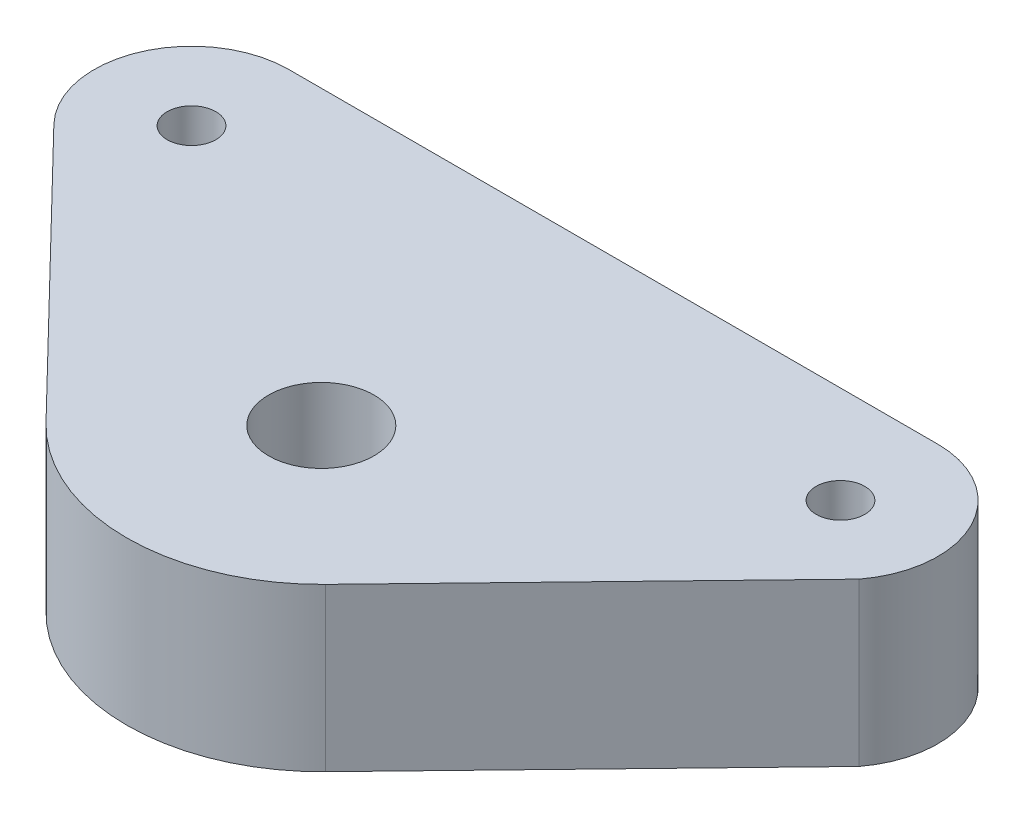
ISO-10303-21;
HEADER;
FILE_DESCRIPTION(('STEP AP214'),'2;1');
FILE_NAME('part.step','',(''),(''),'','','');
FILE_SCHEMA(('AUTOMOTIVE_DESIGN { 1 0 10303 214 1 1 1 1 }'));
ENDSEC;
DATA;
#1=APPLICATION_CONTEXT('core data for automotive mechanical design processes');
#2=APPLICATION_PROTOCOL_DEFINITION('international standard','automotive_design',2000,#1);
#3=PRODUCT_CONTEXT('',#1,'mechanical');
#4=PRODUCT('Part','Part','',(#3));
#5=PRODUCT_RELATED_PRODUCT_CATEGORY('part','',(#4));
#6=PRODUCT_DEFINITION_FORMATION('','',#4);
#7=PRODUCT_DEFINITION_CONTEXT('part definition',#1,'design');
#8=PRODUCT_DEFINITION('design','',#6,#7);
#9=PRODUCT_DEFINITION_SHAPE('','',#8);
#10=(LENGTH_UNIT() NAMED_UNIT(*) SI_UNIT(.MILLI.,.METRE.));
#11=(NAMED_UNIT(*) PLANE_ANGLE_UNIT() SI_UNIT($,.RADIAN.));
#12=(NAMED_UNIT(*) SI_UNIT($,.STERADIAN.) SOLID_ANGLE_UNIT());
#13=UNCERTAINTY_MEASURE_WITH_UNIT(LENGTH_MEASURE(1.E-05),#10,'distance_accuracy_value','');
#14=(GEOMETRIC_REPRESENTATION_CONTEXT(3) GLOBAL_UNCERTAINTY_ASSIGNED_CONTEXT((#13)) GLOBAL_UNIT_ASSIGNED_CONTEXT((#10,
#11,#12)) REPRESENTATION_CONTEXT('',''));
#15=CARTESIAN_POINT('',(0.,0.,0.));
#16=DIRECTION('',(0.,0.,1.));
#17=DIRECTION('',(1.,0.,0.));
#18=AXIS2_PLACEMENT_3D('',#15,#16,#17);
#19=CARTESIAN_POINT('',(20.,10.,-12.));
#20=DIRECTION('',(0.,-1.,0.));
#21=DIRECTION('',(0.,0.,-1.));
#22=AXIS2_PLACEMENT_3D('',#19,#20,#21);
#23=CYLINDRICAL_SURFACE('',#22,1.5);
#24=CARTESIAN_POINT('',(20.,10.,-12.));
#25=DIRECTION('',(0.,1.,0.));
#26=DIRECTION('',(0.,0.,1.));
#27=AXIS2_PLACEMENT_3D('',#24,#25,#26);
#28=CIRCLE('',#27,1.5);
#29=CARTESIAN_POINT('',(20.,10.,-10.5));
#30=VERTEX_POINT('',#29);
#31=EDGE_CURVE('E126',#30,#30,#28,.T.);
#32=ORIENTED_EDGE('',*,*,#31,.T.);
#33=EDGE_LOOP('',(#32));
#34=FACE_BOUND('',#33,.T.);
#35=CARTESIAN_POINT('',(20.,5.,-12.));
#36=DIRECTION('',(0.,-1.,0.));
#37=DIRECTION('',(0.,0.,-1.));
#38=AXIS2_PLACEMENT_3D('',#35,#36,#37);
#39=CIRCLE('',#38,1.5);
#40=CARTESIAN_POINT('',(20.,5.,-13.5));
#41=VERTEX_POINT('',#40);
#42=EDGE_CURVE('E41',#41,#41,#39,.T.);
#43=ORIENTED_EDGE('',*,*,#42,.T.);
#44=EDGE_LOOP('',(#43));
#45=FACE_BOUND('',#44,.T.);
#46=ADVANCED_FACE('F37',(#34,#45),#23,.F.);
#47=CARTESIAN_POINT('',(-20.,10.,-12.));
#48=DIRECTION('',(0.,-1.,0.));
#49=DIRECTION('',(0.,0.,-1.));
#50=AXIS2_PLACEMENT_3D('',#47,#48,#49);
#51=CYLINDRICAL_SURFACE('',#50,1.5);
#52=CARTESIAN_POINT('',(-20.,10.,-12.));
#53=DIRECTION('',(0.,1.,0.));
#54=DIRECTION('',(0.,0.,1.));
#55=AXIS2_PLACEMENT_3D('',#52,#53,#54);
#56=CIRCLE('',#55,1.5);
#57=CARTESIAN_POINT('',(-20.,10.,-10.5));
#58=VERTEX_POINT('',#57);
#59=EDGE_CURVE('E120',#58,#58,#56,.T.);
#60=ORIENTED_EDGE('',*,*,#59,.T.);
#61=EDGE_LOOP('',(#60));
#62=FACE_BOUND('',#61,.T.);
#63=CARTESIAN_POINT('',(-20.,5.,-12.));
#64=DIRECTION('',(0.,-1.,0.));
#65=DIRECTION('',(0.,0.,-1.));
#66=AXIS2_PLACEMENT_3D('',#63,#64,#65);
#67=CIRCLE('',#66,1.5);
#68=CARTESIAN_POINT('',(-20.,5.,-13.5));
#69=VERTEX_POINT('',#68);
#70=EDGE_CURVE('E153',#69,#69,#67,.T.);
#71=ORIENTED_EDGE('',*,*,#70,.T.);
#72=EDGE_LOOP('',(#71));
#73=FACE_BOUND('',#72,.T.);
#74=ADVANCED_FACE('F197',(#62,#73),#51,.F.);
#75=CARTESIAN_POINT('',(0.,10.,0.));
#76=DIRECTION('',(0.,-1.,0.));
#77=DIRECTION('',(0.,0.,-1.));
#78=AXIS2_PLACEMENT_3D('',#75,#76,#77);
#79=CYLINDRICAL_SURFACE('',#78,1.5);
#80=CARTESIAN_POINT('',(0.,0.,0.));
#81=DIRECTION('',(0.,1.,0.));
#82=DIRECTION('',(0.,0.,1.));
#83=AXIS2_PLACEMENT_3D('',#80,#81,#82);
#84=CIRCLE('',#83,1.5);
#85=CARTESIAN_POINT('',(0.,0.,1.5));
#86=VERTEX_POINT('',#85);
#87=EDGE_CURVE('E142',#86,#86,#84,.T.);
#88=ORIENTED_EDGE('',*,*,#87,.F.);
#89=EDGE_LOOP('',(#88));
#90=FACE_BOUND('',#89,.T.);
#91=CARTESIAN_POINT('',(0.,5.,0.));
#92=DIRECTION('',(0.,1.,0.));
#93=DIRECTION('',(0.,0.,1.));
#94=AXIS2_PLACEMENT_3D('',#91,#92,#93);
#95=CIRCLE('',#94,1.5);
#96=CARTESIAN_POINT('',(0.,5.,1.5));
#97=VERTEX_POINT('',#96);
#98=EDGE_CURVE('E133',#97,#97,#95,.T.);
#99=ORIENTED_EDGE('',*,*,#98,.T.);
#100=EDGE_LOOP('',(#99));
#101=FACE_BOUND('',#100,.T.);
#102=ADVANCED_FACE('F192',(#90,#101),#79,.F.);
#103=CARTESIAN_POINT('',(-8.61322641330951,10.,8.35537735551587));
#104=DIRECTION('',(-0.717768867775793,0.,0.696281446292989));
#105=DIRECTION('',(0.696281446292989,0.,0.717768867775793));
#106=AXIS2_PLACEMENT_3D('',#103,#104,#105);
#107=PLANE('',#106);
#108=DIRECTION('',(-0.696281446292989,0.,-0.717768867775793));
#109=VECTOR('',#108,1.);
#110=CARTESIAN_POINT('',(-8.61322641330951,0.,8.35537735551587));
#111=LINE('',#110,#109);
#112=CARTESIAN_POINT('',(-8.61322641330952,0.,8.35537735551586));
#113=VERTEX_POINT('',#112);
#114=CARTESIAN_POINT('',(-24.3066132066548,0.,-7.82231132224207));
#115=VERTEX_POINT('',#114);
#116=EDGE_CURVE('E129',#113,#115,#111,.T.);
#117=ORIENTED_EDGE('',*,*,#116,.F.);
#118=DIRECTION('',(0.,-1.,0.));
#119=VECTOR('',#118,1.);
#120=CARTESIAN_POINT('',(-8.61322641330952,10.,8.35537735551586));
#121=LINE('',#120,#119);
#122=CARTESIAN_POINT('',(-8.61322641330952,10.,8.35537735551586));
#123=VERTEX_POINT('',#122);
#124=EDGE_CURVE('E11',#123,#113,#121,.T.);
#125=ORIENTED_EDGE('',*,*,#124,.F.);
#126=DIRECTION('',(-0.696281446292989,0.,-0.717768867775793));
#127=VECTOR('',#126,1.);
#128=CARTESIAN_POINT('',(-8.61322641330951,10.,8.35537735551587));
#129=LINE('',#128,#127);
#130=CARTESIAN_POINT('',(-24.3066132066548,10.,-7.82231132224207));
#131=VERTEX_POINT('',#130);
#132=EDGE_CURVE('E145',#123,#131,#129,.T.);
#133=ORIENTED_EDGE('',*,*,#132,.T.);
#134=DIRECTION('',(0.,-1.,0.));
#135=VECTOR('',#134,1.);
#136=CARTESIAN_POINT('',(-24.3066132066548,10.,-7.82231132224207));
#137=LINE('',#136,#135);
#138=EDGE_CURVE('E84',#131,#115,#137,.T.);
#139=ORIENTED_EDGE('',*,*,#138,.T.);
#140=EDGE_LOOP('',(#117,#125,#133,#139));
#141=FACE_BOUND('',#140,.T.);
#142=ADVANCED_FACE('F39',(#141),#107,.T.);
#143=CARTESIAN_POINT('',(0.,10.,0.));
#144=DIRECTION('',(0.,-1.,0.));
#145=DIRECTION('',(0.,0.,-1.));
#146=AXIS2_PLACEMENT_3D('',#143,#144,#145);
#147=CYLINDRICAL_SURFACE('',#146,12.);
#148=CARTESIAN_POINT('',(0.,0.,0.));
#149=DIRECTION('',(0.,1.,0.));
#150=DIRECTION('',(0.,0.,1.));
#151=AXIS2_PLACEMENT_3D('',#148,#149,#150);
#152=CIRCLE('',#151,12.);
#153=CARTESIAN_POINT('',(8.61322641330952,0.,8.35537735551586));
#154=VERTEX_POINT('',#153);
#155=EDGE_CURVE('E132',#113,#154,#152,.T.);
#156=ORIENTED_EDGE('',*,*,#155,.T.);
#157=DIRECTION('',(0.,-1.,0.));
#158=VECTOR('',#157,1.);
#159=CARTESIAN_POINT('',(8.61322641330952,10.,8.35537735551586));
#160=LINE('',#159,#158);
#161=CARTESIAN_POINT('',(8.61322641330952,10.,8.35537735551586));
#162=VERTEX_POINT('',#161);
#163=EDGE_CURVE('E47',#162,#154,#160,.T.);
#164=ORIENTED_EDGE('',*,*,#163,.F.);
#165=CARTESIAN_POINT('',(0.,10.,0.));
#166=DIRECTION('',(0.,1.,0.));
#167=DIRECTION('',(0.,0.,1.));
#168=AXIS2_PLACEMENT_3D('',#165,#166,#167);
#169=CIRCLE('',#168,12.);
#170=EDGE_CURVE('E179',#123,#162,#169,.T.);
#171=ORIENTED_EDGE('',*,*,#170,.F.);
#172=ORIENTED_EDGE('',*,*,#124,.T.);
#173=EDGE_LOOP('',(#156,#164,#171,#172));
#174=FACE_BOUND('',#173,.T.);
#175=ADVANCED_FACE('F182',(#174),#147,.T.);
#176=CARTESIAN_POINT('',(8.62890203409491,10.,8.33915708352362));
#177=DIRECTION('',(-0.719076439933114,0.,-0.694930984726627));
#178=DIRECTION('',(-0.694930984726627,0.,0.719076439933114));
#179=AXIS2_PLACEMENT_3D('',#176,#177,#178);
#180=PLANE('',#179);
#181=DIRECTION('',(0.694930984726627,0.,-0.719076439933114));
#182=VECTOR('',#181,1.);
#183=CARTESIAN_POINT('',(8.62890203409491,0.,8.33915708352362));
#184=LINE('',#183,#182);
#185=CARTESIAN_POINT('',(24.7786778980984,0.,-8.37174455885121));
#186=VERTEX_POINT('',#185);
#187=EDGE_CURVE('E135',#154,#186,#184,.T.);
#188=ORIENTED_EDGE('',*,*,#187,.T.);
#189=DIRECTION('',(0.,-1.,0.));
#190=VECTOR('',#189,1.);
#191=CARTESIAN_POINT('',(24.7786778980984,10.,-8.37174455885121));
#192=LINE('',#191,#190);
#193=CARTESIAN_POINT('',(24.7786778980984,10.,-8.37174455885121));
#194=VERTEX_POINT('',#193);
#195=EDGE_CURVE('E116',#194,#186,#192,.T.);
#196=ORIENTED_EDGE('',*,*,#195,.F.);
#197=DIRECTION('',(0.694930984726627,0.,-0.719076439933114));
#198=VECTOR('',#197,1.);
#199=CARTESIAN_POINT('',(8.62890203409491,10.,8.33915708352362));
#200=LINE('',#199,#198);
#201=EDGE_CURVE('E103',#162,#194,#200,.T.);
#202=ORIENTED_EDGE('',*,*,#201,.F.);
#203=ORIENTED_EDGE('',*,*,#163,.T.);
#204=EDGE_LOOP('',(#188,#196,#202,#203));
#205=FACE_BOUND('',#204,.T.);
#206=ADVANCED_FACE('F186',(#205),#180,.F.);
#207=CARTESIAN_POINT('',(20.,10.,-12.));
#208=DIRECTION('',(0.,-1.,0.));
#209=DIRECTION('',(0.,0.,-1.));
#210=AXIS2_PLACEMENT_3D('',#207,#208,#209);
#211=CYLINDRICAL_SURFACE('',#210,6.);
#212=CARTESIAN_POINT('',(20.,0.,-12.));
#213=DIRECTION('',(0.,1.,0.));
#214=DIRECTION('',(0.,0.,1.));
#215=AXIS2_PLACEMENT_3D('',#212,#213,#214);
#216=CIRCLE('',#215,6.);
#217=CARTESIAN_POINT('',(20.,0.,-18.));
#218=VERTEX_POINT('',#217);
#219=EDGE_CURVE('E112',#186,#218,#216,.T.);
#220=ORIENTED_EDGE('',*,*,#219,.T.);
#221=DIRECTION('',(0.,-1.,0.));
#222=VECTOR('',#221,1.);
#223=CARTESIAN_POINT('',(20.,10.,-18.));
#224=LINE('',#223,#222);
#225=CARTESIAN_POINT('',(20.,10.,-18.));
#226=VERTEX_POINT('',#225);
#227=EDGE_CURVE('E109',#226,#218,#224,.T.);
#228=ORIENTED_EDGE('',*,*,#227,.F.);
#229=CARTESIAN_POINT('',(20.,10.,-12.));
#230=DIRECTION('',(0.,1.,0.));
#231=DIRECTION('',(0.,0.,1.));
#232=AXIS2_PLACEMENT_3D('',#229,#230,#231);
#233=CIRCLE('',#232,6.);
#234=EDGE_CURVE('E96',#194,#226,#233,.T.);
#235=ORIENTED_EDGE('',*,*,#234,.F.);
#236=ORIENTED_EDGE('',*,*,#195,.T.);
#237=EDGE_LOOP('',(#220,#228,#235,#236));
#238=FACE_BOUND('',#237,.T.);
#239=ADVANCED_FACE('F110',(#238),#211,.T.);
#240=CARTESIAN_POINT('',(0.,10.,-18.));
#241=DIRECTION('',(0.,0.,-1.));
#242=DIRECTION('',(-1.,0.,0.));
#243=AXIS2_PLACEMENT_3D('',#240,#241,#242);
#244=PLANE('',#243);
#245=DIRECTION('',(1.,0.,0.));
#246=VECTOR('',#245,1.);
#247=CARTESIAN_POINT('',(0.,0.,-18.));
#248=LINE('',#247,#246);
#249=CARTESIAN_POINT('',(-20.,0.,-18.));
#250=VERTEX_POINT('',#249);
#251=EDGE_CURVE('E138',#250,#218,#248,.T.);
#252=ORIENTED_EDGE('',*,*,#251,.F.);
#253=DIRECTION('',(0.,-1.,0.));
#254=VECTOR('',#253,1.);
#255=CARTESIAN_POINT('',(-20.,10.,-18.));
#256=LINE('',#255,#254);
#257=CARTESIAN_POINT('',(-20.,10.,-18.));
#258=VERTEX_POINT('',#257);
#259=EDGE_CURVE('E77',#258,#250,#256,.T.);
#260=ORIENTED_EDGE('',*,*,#259,.F.);
#261=DIRECTION('',(1.,0.,0.));
#262=VECTOR('',#261,1.);
#263=CARTESIAN_POINT('',(0.,10.,-18.));
#264=LINE('',#263,#262);
#265=EDGE_CURVE('E101',#258,#226,#264,.T.);
#266=ORIENTED_EDGE('',*,*,#265,.T.);
#267=ORIENTED_EDGE('',*,*,#227,.T.);
#268=EDGE_LOOP('',(#252,#260,#266,#267));
#269=FACE_BOUND('',#268,.T.);
#270=ADVANCED_FACE('F118',(#269),#244,.T.);
#271=CARTESIAN_POINT('',(-20.,10.,-12.));
#272=DIRECTION('',(0.,-1.,0.));
#273=DIRECTION('',(0.,0.,-1.));
#274=AXIS2_PLACEMENT_3D('',#271,#272,#273);
#275=CYLINDRICAL_SURFACE('',#274,6.);
#276=CARTESIAN_POINT('',(-20.,0.,-12.));
#277=DIRECTION('',(0.,1.,0.));
#278=DIRECTION('',(0.,0.,1.));
#279=AXIS2_PLACEMENT_3D('',#276,#277,#278);
#280=CIRCLE('',#279,6.);
#281=EDGE_CURVE('E140',#250,#115,#280,.T.);
#282=ORIENTED_EDGE('',*,*,#281,.T.);
#283=ORIENTED_EDGE('',*,*,#138,.F.);
#284=CARTESIAN_POINT('',(-20.,10.,-12.));
#285=DIRECTION('',(0.,1.,0.));
#286=DIRECTION('',(0.,0.,1.));
#287=AXIS2_PLACEMENT_3D('',#284,#285,#286);
#288=CIRCLE('',#287,6.);
#289=EDGE_CURVE('E56',#258,#131,#288,.T.);
#290=ORIENTED_EDGE('',*,*,#289,.F.);
#291=ORIENTED_EDGE('',*,*,#259,.T.);
#292=EDGE_LOOP('',(#282,#283,#290,#291));
#293=FACE_BOUND('',#292,.T.);
#294=ADVANCED_FACE('F190',(#293),#275,.T.);
#295=CARTESIAN_POINT('',(0.,10.,0.));
#296=DIRECTION('',(0.,1.,0.));
#297=DIRECTION('',(0.,0.,1.));
#298=AXIS2_PLACEMENT_3D('',#295,#296,#297);
#299=PLANE('',#298);
#300=CARTESIAN_POINT('',(0.,10.,0.));
#301=DIRECTION('',(0.,1.,0.));
#302=DIRECTION('',(0.,0.,1.));
#303=AXIS2_PLACEMENT_3D('',#300,#301,#302);
#304=CIRCLE('',#303,3.25);
#305=CARTESIAN_POINT('',(0.,10.,3.25));
#306=VERTEX_POINT('',#305);
#307=EDGE_CURVE('E159',#306,#306,#304,.T.);
#308=ORIENTED_EDGE('',*,*,#307,.F.);
#309=EDGE_LOOP('',(#308));
#310=FACE_BOUND('',#309,.T.);
#311=ORIENTED_EDGE('',*,*,#132,.F.);
#312=ORIENTED_EDGE('',*,*,#170,.T.);
#313=ORIENTED_EDGE('',*,*,#201,.T.);
#314=ORIENTED_EDGE('',*,*,#234,.T.);
#315=ORIENTED_EDGE('',*,*,#265,.F.);
#316=ORIENTED_EDGE('',*,*,#289,.T.);
#317=EDGE_LOOP('',(#311,#312,#313,#314,#315,#316));
#318=FACE_BOUND('',#317,.T.);
#319=ORIENTED_EDGE('',*,*,#59,.F.);
#320=EDGE_LOOP('',(#319));
#321=FACE_BOUND('',#320,.T.);
#322=ORIENTED_EDGE('',*,*,#31,.F.);
#323=EDGE_LOOP('',(#322));
#324=FACE_BOUND('',#323,.T.);
#325=ADVANCED_FACE('F98',(#310,#318,#321,#324),#299,.T.);
#326=CARTESIAN_POINT('',(0.,0.,0.));
#327=DIRECTION('',(0.,1.,0.));
#328=DIRECTION('',(0.,0.,1.));
#329=AXIS2_PLACEMENT_3D('',#326,#327,#328);
#330=PLANE('',#329);
#331=CARTESIAN_POINT('',(20.,0.,-12.));
#332=DIRECTION('',(0.,-1.,0.));
#333=DIRECTION('',(0.,0.,-1.));
#334=AXIS2_PLACEMENT_3D('',#331,#332,#333);
#335=CIRCLE('',#334,3.25);
#336=CARTESIAN_POINT('',(20.,0.,-15.25));
#337=VERTEX_POINT('',#336);
#338=EDGE_CURVE('E161',#337,#337,#335,.T.);
#339=ORIENTED_EDGE('',*,*,#338,.F.);
#340=EDGE_LOOP('',(#339));
#341=FACE_BOUND('',#340,.T.);
#342=CARTESIAN_POINT('',(-20.,0.,-12.));
#343=DIRECTION('',(0.,-1.,0.));
#344=DIRECTION('',(0.,0.,-1.));
#345=AXIS2_PLACEMENT_3D('',#342,#343,#344);
#346=CIRCLE('',#345,3.25);
#347=CARTESIAN_POINT('',(-20.,0.,-15.25));
#348=VERTEX_POINT('',#347);
#349=EDGE_CURVE('E171',#348,#348,#346,.T.);
#350=ORIENTED_EDGE('',*,*,#349,.F.);
#351=EDGE_LOOP('',(#350));
#352=FACE_BOUND('',#351,.T.);
#353=ORIENTED_EDGE('',*,*,#116,.T.);
#354=ORIENTED_EDGE('',*,*,#281,.F.);
#355=ORIENTED_EDGE('',*,*,#251,.T.);
#356=ORIENTED_EDGE('',*,*,#219,.F.);
#357=ORIENTED_EDGE('',*,*,#187,.F.);
#358=ORIENTED_EDGE('',*,*,#155,.F.);
#359=EDGE_LOOP('',(#353,#354,#355,#356,#357,#358));
#360=FACE_BOUND('',#359,.T.);
#361=ORIENTED_EDGE('',*,*,#87,.T.);
#362=EDGE_LOOP('',(#361));
#363=FACE_BOUND('',#362,.T.);
#364=ADVANCED_FACE('F188',(#341,#352,#360,#363),#330,.F.);
#365=CARTESIAN_POINT('',(0.,5.,0.));
#366=DIRECTION('',(0.,1.,0.));
#367=DIRECTION('',(0.,0.,1.));
#368=AXIS2_PLACEMENT_3D('',#365,#366,#367);
#369=CYLINDRICAL_SURFACE('',#368,3.25);
#370=CARTESIAN_POINT('',(0.,5.,0.));
#371=DIRECTION('',(0.,1.,0.));
#372=DIRECTION('',(0.,0.,1.));
#373=AXIS2_PLACEMENT_3D('',#370,#371,#372);
#374=CIRCLE('',#373,3.25);
#375=CARTESIAN_POINT('',(0.,5.,3.25));
#376=VERTEX_POINT('',#375);
#377=EDGE_CURVE('E152',#376,#376,#374,.T.);
#378=ORIENTED_EDGE('',*,*,#377,.F.);
#379=EDGE_LOOP('',(#378));
#380=FACE_BOUND('',#379,.T.);
#381=ORIENTED_EDGE('',*,*,#307,.T.);
#382=EDGE_LOOP('',(#381));
#383=FACE_BOUND('',#382,.T.);
#384=ADVANCED_FACE('F249',(#380,#383),#369,.F.);
#385=CARTESIAN_POINT('',(0.,5.,0.));
#386=DIRECTION('',(0.,1.,0.));
#387=DIRECTION('',(0.,0.,1.));
#388=AXIS2_PLACEMENT_3D('',#385,#386,#387);
#389=PLANE('',#388);
#390=ORIENTED_EDGE('',*,*,#98,.F.);
#391=EDGE_LOOP('',(#390));
#392=FACE_BOUND('',#391,.T.);
#393=ORIENTED_EDGE('',*,*,#377,.T.);
#394=EDGE_LOOP('',(#393));
#395=FACE_BOUND('',#394,.T.);
#396=ADVANCED_FACE('F257',(#392,#395),#389,.T.);
#397=CARTESIAN_POINT('',(-20.,5.,-12.));
#398=DIRECTION('',(0.,-1.,0.));
#399=DIRECTION('',(0.,0.,-1.));
#400=AXIS2_PLACEMENT_3D('',#397,#398,#399);
#401=CYLINDRICAL_SURFACE('',#400,3.25);
#402=CARTESIAN_POINT('',(-20.,5.,-12.));
#403=DIRECTION('',(0.,-1.,0.));
#404=DIRECTION('',(0.,0.,-1.));
#405=AXIS2_PLACEMENT_3D('',#402,#403,#404);
#406=CIRCLE('',#405,3.25);
#407=CARTESIAN_POINT('',(-20.,5.,-15.25));
#408=VERTEX_POINT('',#407);
#409=EDGE_CURVE('E166',#408,#408,#406,.T.);
#410=ORIENTED_EDGE('',*,*,#409,.F.);
#411=EDGE_LOOP('',(#410));
#412=FACE_BOUND('',#411,.T.);
#413=ORIENTED_EDGE('',*,*,#349,.T.);
#414=EDGE_LOOP('',(#413));
#415=FACE_BOUND('',#414,.T.);
#416=ADVANCED_FACE('F265',(#412,#415),#401,.F.);
#417=CARTESIAN_POINT('',(-20.,5.,-12.));
#418=DIRECTION('',(0.,-1.,0.));
#419=DIRECTION('',(0.,0.,-1.));
#420=AXIS2_PLACEMENT_3D('',#417,#418,#419);
#421=PLANE('',#420);
#422=ORIENTED_EDGE('',*,*,#70,.F.);
#423=EDGE_LOOP('',(#422));
#424=FACE_BOUND('',#423,.T.);
#425=ORIENTED_EDGE('',*,*,#409,.T.);
#426=EDGE_LOOP('',(#425));
#427=FACE_BOUND('',#426,.T.);
#428=ADVANCED_FACE('F272',(#424,#427),#421,.T.);
#429=CARTESIAN_POINT('',(20.,5.,-12.));
#430=DIRECTION('',(0.,-1.,0.));
#431=DIRECTION('',(0.,0.,-1.));
#432=AXIS2_PLACEMENT_3D('',#429,#430,#431);
#433=CYLINDRICAL_SURFACE('',#432,3.25);
#434=CARTESIAN_POINT('',(20.,5.,-12.));
#435=DIRECTION('',(0.,-1.,0.));
#436=DIRECTION('',(0.,0.,-1.));
#437=AXIS2_PLACEMENT_3D('',#434,#435,#436);
#438=CIRCLE('',#437,3.25);
#439=CARTESIAN_POINT('',(20.,5.,-15.25));
#440=VERTEX_POINT('',#439);
#441=EDGE_CURVE('E155',#440,#440,#438,.T.);
#442=ORIENTED_EDGE('',*,*,#441,.F.);
#443=EDGE_LOOP('',(#442));
#444=FACE_BOUND('',#443,.T.);
#445=ORIENTED_EDGE('',*,*,#338,.T.);
#446=EDGE_LOOP('',(#445));
#447=FACE_BOUND('',#446,.T.);
#448=ADVANCED_FACE('F280',(#444,#447),#433,.F.);
#449=CARTESIAN_POINT('',(20.,5.,-12.));
#450=DIRECTION('',(0.,-1.,0.));
#451=DIRECTION('',(0.,0.,-1.));
#452=AXIS2_PLACEMENT_3D('',#449,#450,#451);
#453=PLANE('',#452);
#454=ORIENTED_EDGE('',*,*,#42,.F.);
#455=EDGE_LOOP('',(#454));
#456=FACE_BOUND('',#455,.T.);
#457=ORIENTED_EDGE('',*,*,#441,.T.);
#458=EDGE_LOOP('',(#457));
#459=FACE_BOUND('',#458,.T.);
#460=ADVANCED_FACE('F288',(#456,#459),#453,.T.);
#461=CLOSED_SHELL('',(#46,#74,#102,#142,#175,#206,#239,#270,#294,#325,#364,#384,#396,#416,#428,
#448,#460));
#462=MANIFOLD_SOLID_BREP('B2',#461);
#463=ADVANCED_BREP_SHAPE_REPRESENTATION('',(#18,#462),#14);
#464=SHAPE_DEFINITION_REPRESENTATION(#9,#463);
ENDSEC;
END-ISO-10303-21;
